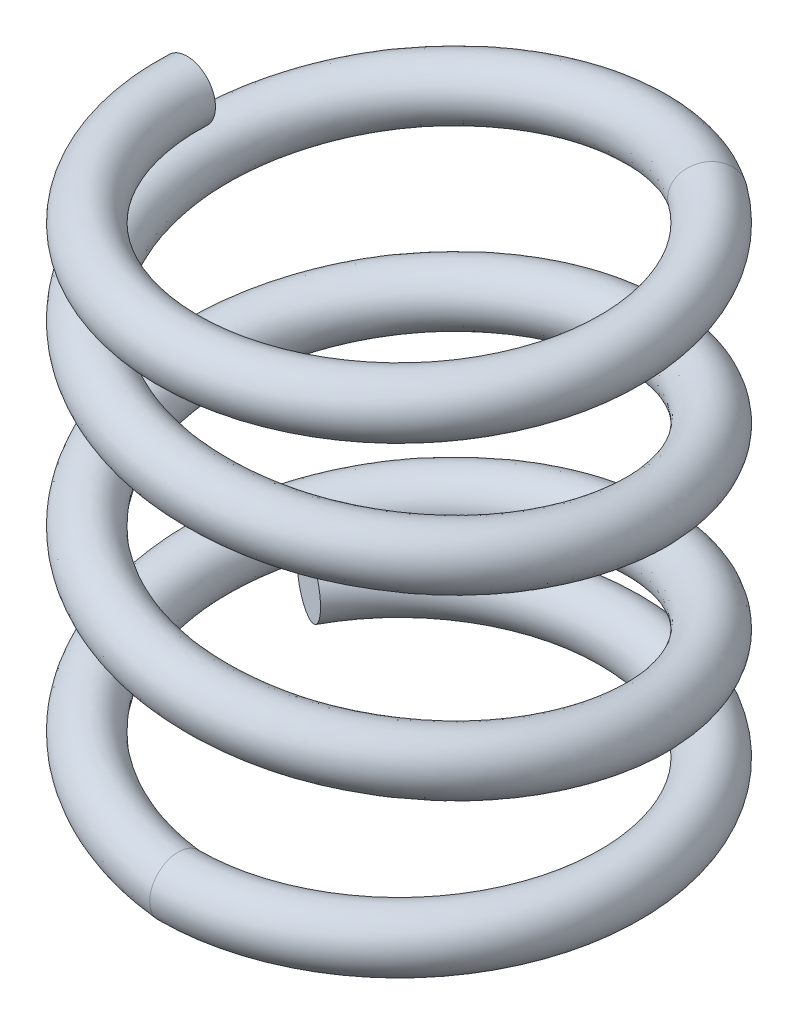
ISO-10303-21;
HEADER;
FILE_DESCRIPTION(('STEP AP214'),'2;1');
FILE_NAME('part.step','',(''),(''),'','','');
FILE_SCHEMA(('AUTOMOTIVE_DESIGN { 1 0 10303 214 1 1 1 1 }'));
ENDSEC;
DATA;
#1=APPLICATION_CONTEXT('core data for automotive mechanical design processes');
#2=APPLICATION_PROTOCOL_DEFINITION('international standard','automotive_design',2000,#1);
#3=PRODUCT_CONTEXT('',#1,'mechanical');
#4=PRODUCT('Part','Part','',(#3));
#5=PRODUCT_RELATED_PRODUCT_CATEGORY('part','',(#4));
#6=PRODUCT_DEFINITION_FORMATION('','',#4);
#7=PRODUCT_DEFINITION_CONTEXT('part definition',#1,'design');
#8=PRODUCT_DEFINITION('design','',#6,#7);
#9=PRODUCT_DEFINITION_SHAPE('','',#8);
#10=(LENGTH_UNIT() NAMED_UNIT(*) SI_UNIT(.MILLI.,.METRE.));
#11=(NAMED_UNIT(*) PLANE_ANGLE_UNIT() SI_UNIT($,.RADIAN.));
#12=(NAMED_UNIT(*) SI_UNIT($,.STERADIAN.) SOLID_ANGLE_UNIT());
#13=UNCERTAINTY_MEASURE_WITH_UNIT(LENGTH_MEASURE(1.E-05),#10,'distance_accuracy_value','');
#14=(GEOMETRIC_REPRESENTATION_CONTEXT(3) GLOBAL_UNCERTAINTY_ASSIGNED_CONTEXT((#13)) GLOBAL_UNIT_ASSIGNED_CONTEXT((#10,
#11,#12)) REPRESENTATION_CONTEXT('',''));
#15=CARTESIAN_POINT('',(0.,0.,0.));
#16=DIRECTION('',(0.,0.,1.));
#17=DIRECTION('',(1.,0.,0.));
#18=AXIS2_PLACEMENT_3D('',#15,#16,#17);
#19=CARTESIAN_POINT('',(0.,0.,2.7));
#20=CARTESIAN_POINT('',(-0.877283179828847,0.125,2.7));
#21=CARTESIAN_POINT('',(-1.58702018118968,0.25,2.18434588481236));
#22=CARTESIAN_POINT('',(-2.29675718255051,0.375,1.66869176962472));
#23=CARTESIAN_POINT('',(-2.56785259399691,0.5,0.834345884812358));
#24=CARTESIAN_POINT('',(-2.83894800544332,0.625,0.));
#25=CARTESIAN_POINT('',(-2.56785259399691,0.75,-0.834345884812358));
#26=CARTESIAN_POINT('',(-2.29675718255051,0.875,-1.66869176962472));
#27=CARTESIAN_POINT('',(-1.58702018118968,1.,-2.18434588481236));
#28=CARTESIAN_POINT('',(-0.877283179828847,1.125,-2.7));
#29=CARTESIAN_POINT('',(0.,1.25,-2.7));
#30=CARTESIAN_POINT('',(0.877283179828847,1.375,-2.7));
#31=CARTESIAN_POINT('',(1.58702018118968,1.5,-2.18434588481236));
#32=CARTESIAN_POINT('',(2.29675718255051,1.625,-1.66869176962472));
#33=CARTESIAN_POINT('',(2.56785259399691,1.75,-0.834345884812358));
#34=CARTESIAN_POINT('',(2.83894800544332,1.875,0.));
#35=CARTESIAN_POINT('',(2.56785259399691,2.,0.834345884812357));
#36=CARTESIAN_POINT('',(2.29675718255051,2.125,1.66869176962472));
#37=CARTESIAN_POINT('',(1.58702018118968,2.25,2.18434588481236));
#38=CARTESIAN_POINT('',(0.877283179828848,2.375,2.7));
#39=CARTESIAN_POINT('',(0.,2.5,2.7));
#40=CARTESIAN_POINT('',(-0.877283179828847,2.625,2.7));
#41=CARTESIAN_POINT('',(-1.58702018118968,2.75,2.18434588481236));
#42=CARTESIAN_POINT('',(-2.29675718255051,2.875,1.66869176962472));
#43=CARTESIAN_POINT('',(-2.56785259399691,3.,0.834345884812358));
#44=CARTESIAN_POINT('',(-2.83894800544332,3.125,0.));
#45=CARTESIAN_POINT('',(-2.56785259399691,3.25,-0.834345884812358));
#46=CARTESIAN_POINT('',(-2.29675718255051,3.375,-1.66869176962472));
#47=CARTESIAN_POINT('',(-1.58702018118968,3.5,-2.18434588481236));
#48=CARTESIAN_POINT('',(-0.877283179828847,3.625,-2.7));
#49=CARTESIAN_POINT('',(0.,3.75,-2.7));
#50=CARTESIAN_POINT('',(0.877283179828847,3.875,-2.7));
#51=CARTESIAN_POINT('',(1.58702018118968,4.,-2.18434588481236));
#52=CARTESIAN_POINT('',(2.29675718255051,4.125,-1.66869176962472));
#53=CARTESIAN_POINT('',(2.56785259399691,4.25,-0.834345884812358));
#54=CARTESIAN_POINT('',(2.83894800544332,4.375,0.));
#55=CARTESIAN_POINT('',(2.56785259399691,4.5,0.834345884812357));
#56=CARTESIAN_POINT('',(2.29675718255051,4.625,1.66869176962472));
#57=CARTESIAN_POINT('',(1.58702018118968,4.75,2.18434588481236));
#58=CARTESIAN_POINT('',(0.877283179828848,4.875,2.7));
#59=CARTESIAN_POINT('',(0.,5.,2.7));
#60=CARTESIAN_POINT('',(-0.877283179828847,5.125,2.7));
#61=CARTESIAN_POINT('',(-1.58702018118968,5.25,2.18434588481236));
#62=CARTESIAN_POINT('',(-2.29675718255051,5.375,1.66869176962472));
#63=CARTESIAN_POINT('',(-2.56785259399691,5.5,0.834345884812358));
#64=CARTESIAN_POINT('',(-2.83894800544332,5.625,0.));
#65=CARTESIAN_POINT('',(-2.56785259399691,5.75,-0.834345884812358));
#66=CARTESIAN_POINT('',(-2.29675718255051,5.875,-1.66869176962472));
#67=CARTESIAN_POINT('',(-1.58702018118968,6.,-2.18434588481236));
#68=CARTESIAN_POINT('',(-0.877283179828847,6.125,-2.7));
#69=CARTESIAN_POINT('',(0.,6.25,-2.7));
#70=CARTESIAN_POINT('',(0.877283179828847,6.375,-2.7));
#71=CARTESIAN_POINT('',(1.58702018118968,6.5,-2.18434588481236));
#72=CARTESIAN_POINT('',(0.,0.800000000000001,2.7));
#73=CARTESIAN_POINT('',(-0.877283179828847,0.925000000000001,2.7));
#74=CARTESIAN_POINT('',(-1.58702018118968,1.05,2.18434588481236));
#75=CARTESIAN_POINT('',(-2.29675718255051,1.175,1.66869176962472));
#76=CARTESIAN_POINT('',(-2.56785259399691,1.3,0.834345884812358));
#77=CARTESIAN_POINT('',(-2.83894800544332,1.425,0.));
#78=CARTESIAN_POINT('',(-2.56785259399691,1.55,-0.834345884812358));
#79=CARTESIAN_POINT('',(-2.29675718255051,1.675,-1.66869176962472));
#80=CARTESIAN_POINT('',(-1.58702018118968,1.8,-2.18434588481236));
#81=CARTESIAN_POINT('',(-0.877283179828847,1.925,-2.7));
#82=CARTESIAN_POINT('',(0.,2.05,-2.7));
#83=CARTESIAN_POINT('',(0.877283179828847,2.175,-2.7));
#84=CARTESIAN_POINT('',(1.58702018118968,2.3,-2.18434588481236));
#85=CARTESIAN_POINT('',(2.29675718255051,2.425,-1.66869176962472));
#86=CARTESIAN_POINT('',(2.56785259399691,2.55,-0.834345884812358));
#87=CARTESIAN_POINT('',(2.83894800544332,2.675,0.));
#88=CARTESIAN_POINT('',(2.56785259399691,2.8,0.834345884812357));
#89=CARTESIAN_POINT('',(2.29675718255051,2.925,1.66869176962472));
#90=CARTESIAN_POINT('',(1.58702018118968,3.05,2.18434588481236));
#91=CARTESIAN_POINT('',(0.877283179828848,3.175,2.7));
#92=CARTESIAN_POINT('',(0.,3.3,2.7));
#93=CARTESIAN_POINT('',(-0.877283179828847,3.425,2.7));
#94=CARTESIAN_POINT('',(-1.58702018118968,3.55,2.18434588481236));
#95=CARTESIAN_POINT('',(-2.29675718255051,3.675,1.66869176962472));
#96=CARTESIAN_POINT('',(-2.56785259399691,3.8,0.834345884812358));
#97=CARTESIAN_POINT('',(-2.83894800544332,3.925,0.));
#98=CARTESIAN_POINT('',(-2.56785259399691,4.05,-0.834345884812358));
#99=CARTESIAN_POINT('',(-2.29675718255051,4.175,-1.66869176962472));
#100=CARTESIAN_POINT('',(-1.58702018118968,4.3,-2.18434588481236));
#101=CARTESIAN_POINT('',(-0.877283179828847,4.425,-2.7));
#102=CARTESIAN_POINT('',(0.,4.55,-2.7));
#103=CARTESIAN_POINT('',(0.877283179828847,4.675,-2.7));
#104=CARTESIAN_POINT('',(1.58702018118968,4.8,-2.18434588481236));
#105=CARTESIAN_POINT('',(2.29675718255051,4.925,-1.66869176962472));
#106=CARTESIAN_POINT('',(2.56785259399691,5.05,-0.834345884812358));
#107=CARTESIAN_POINT('',(2.83894800544332,5.175,0.));
#108=CARTESIAN_POINT('',(2.56785259399691,5.3,0.834345884812357));
#109=CARTESIAN_POINT('',(2.29675718255051,5.425,1.66869176962472));
#110=CARTESIAN_POINT('',(1.58702018118968,5.55,2.18434588481236));
#111=CARTESIAN_POINT('',(0.877283179828848,5.675,2.7));
#112=CARTESIAN_POINT('',(0.,5.8,2.7));
#113=CARTESIAN_POINT('',(-0.877283179828847,5.925,2.7));
#114=CARTESIAN_POINT('',(-1.58702018118968,6.05,2.18434588481236));
#115=CARTESIAN_POINT('',(-2.29675718255051,6.175,1.66869176962472));
#116=CARTESIAN_POINT('',(-2.56785259399691,6.3,0.834345884812358));
#117=CARTESIAN_POINT('',(-2.83894800544332,6.425,0.));
#118=CARTESIAN_POINT('',(-2.56785259399691,6.55,-0.834345884812358));
#119=CARTESIAN_POINT('',(-2.29675718255051,6.675,-1.66869176962472));
#120=CARTESIAN_POINT('',(-1.58702018118968,6.8,-2.18434588481236));
#121=CARTESIAN_POINT('',(-0.877283179828847,6.925,-2.7));
#122=CARTESIAN_POINT('',(0.,7.05,-2.7));
#123=CARTESIAN_POINT('',(0.877283179828847,7.175,-2.7));
#124=CARTESIAN_POINT('',(1.58702018118968,7.3,-2.18434588481236));
#125=CARTESIAN_POINT('',(0.,0.800000000000001,3.5));
#126=CARTESIAN_POINT('',(-1.13721893681517,0.925000000000001,3.5));
#127=CARTESIAN_POINT('',(-2.05724838302366,1.05,2.83155948031232));
#128=CARTESIAN_POINT('',(-2.97727782923214,1.175,2.16311896062463));
#129=CARTESIAN_POINT('',(-3.32869780703304,1.3,1.08155948031232));
#130=CARTESIAN_POINT('',(-3.68011778483394,1.425,0.));
#131=CARTESIAN_POINT('',(-3.32869780703304,1.55,-1.08155948031232));
#132=CARTESIAN_POINT('',(-2.97727782923214,1.675,-2.16311896062463));
#133=CARTESIAN_POINT('',(-2.05724838302366,1.8,-2.83155948031232));
#134=CARTESIAN_POINT('',(-1.13721893681517,1.925,-3.5));
#135=CARTESIAN_POINT('',(0.,2.05,-3.5));
#136=CARTESIAN_POINT('',(1.13721893681517,2.175,-3.5));
#137=CARTESIAN_POINT('',(2.05724838302366,2.3,-2.83155948031232));
#138=CARTESIAN_POINT('',(2.97727782923214,2.425,-2.16311896062463));
#139=CARTESIAN_POINT('',(3.32869780703304,2.55,-1.08155948031232));
#140=CARTESIAN_POINT('',(3.68011778483394,2.675,0.));
#141=CARTESIAN_POINT('',(3.32869780703304,2.8,1.08155948031232));
#142=CARTESIAN_POINT('',(2.97727782923214,2.925,2.16311896062463));
#143=CARTESIAN_POINT('',(2.05724838302366,3.05,2.83155948031232));
#144=CARTESIAN_POINT('',(1.13721893681517,3.175,3.5));
#145=CARTESIAN_POINT('',(0.,3.3,3.5));
#146=CARTESIAN_POINT('',(-1.13721893681517,3.425,3.5));
#147=CARTESIAN_POINT('',(-2.05724838302366,3.55,2.83155948031232));
#148=CARTESIAN_POINT('',(-2.97727782923214,3.675,2.16311896062463));
#149=CARTESIAN_POINT('',(-3.32869780703304,3.8,1.08155948031232));
#150=CARTESIAN_POINT('',(-3.68011778483394,3.925,0.));
#151=CARTESIAN_POINT('',(-3.32869780703304,4.05,-1.08155948031232));
#152=CARTESIAN_POINT('',(-2.97727782923214,4.175,-2.16311896062463));
#153=CARTESIAN_POINT('',(-2.05724838302366,4.3,-2.83155948031232));
#154=CARTESIAN_POINT('',(-1.13721893681517,4.425,-3.5));
#155=CARTESIAN_POINT('',(0.,4.55,-3.5));
#156=CARTESIAN_POINT('',(1.13721893681517,4.675,-3.5));
#157=CARTESIAN_POINT('',(2.05724838302366,4.8,-2.83155948031232));
#158=CARTESIAN_POINT('',(2.97727782923214,4.925,-2.16311896062463));
#159=CARTESIAN_POINT('',(3.32869780703304,5.05,-1.08155948031232));
#160=CARTESIAN_POINT('',(3.68011778483394,5.175,0.));
#161=CARTESIAN_POINT('',(3.32869780703304,5.3,1.08155948031232));
#162=CARTESIAN_POINT('',(2.97727782923214,5.425,2.16311896062463));
#163=CARTESIAN_POINT('',(2.05724838302366,5.55,2.83155948031232));
#164=CARTESIAN_POINT('',(1.13721893681517,5.675,3.5));
#165=CARTESIAN_POINT('',(0.,5.8,3.5));
#166=CARTESIAN_POINT('',(-1.13721893681517,5.925,3.5));
#167=CARTESIAN_POINT('',(-2.05724838302366,6.05,2.83155948031232));
#168=CARTESIAN_POINT('',(-2.97727782923214,6.175,2.16311896062463));
#169=CARTESIAN_POINT('',(-3.32869780703304,6.3,1.08155948031232));
#170=CARTESIAN_POINT('',(-3.68011778483394,6.425,0.));
#171=CARTESIAN_POINT('',(-3.32869780703304,6.55,-1.08155948031232));
#172=CARTESIAN_POINT('',(-2.97727782923214,6.675,-2.16311896062463));
#173=CARTESIAN_POINT('',(-2.05724838302366,6.8,-2.83155948031232));
#174=CARTESIAN_POINT('',(-1.13721893681517,6.925,-3.5));
#175=CARTESIAN_POINT('',(0.,7.05,-3.5));
#176=CARTESIAN_POINT('',(1.13721893681517,7.175,-3.5));
#177=CARTESIAN_POINT('',(2.05724838302366,7.3,-2.83155948031232));
#178=CARTESIAN_POINT('',(0.,0.,3.5));
#179=CARTESIAN_POINT('',(-1.13721893681517,0.125,3.5));
#180=CARTESIAN_POINT('',(-2.05724838302366,0.25,2.83155948031232));
#181=CARTESIAN_POINT('',(-2.97727782923214,0.375,2.16311896062463));
#182=CARTESIAN_POINT('',(-3.32869780703304,0.5,1.08155948031232));
#183=CARTESIAN_POINT('',(-3.68011778483394,0.625,0.));
#184=CARTESIAN_POINT('',(-3.32869780703304,0.75,-1.08155948031232));
#185=CARTESIAN_POINT('',(-2.97727782923214,0.875,-2.16311896062463));
#186=CARTESIAN_POINT('',(-2.05724838302366,1.,-2.83155948031232));
#187=CARTESIAN_POINT('',(-1.13721893681517,1.125,-3.5));
#188=CARTESIAN_POINT('',(0.,1.25,-3.5));
#189=CARTESIAN_POINT('',(1.13721893681517,1.375,-3.5));
#190=CARTESIAN_POINT('',(2.05724838302366,1.5,-2.83155948031232));
#191=CARTESIAN_POINT('',(2.97727782923214,1.625,-2.16311896062463));
#192=CARTESIAN_POINT('',(3.32869780703304,1.75,-1.08155948031232));
#193=CARTESIAN_POINT('',(3.68011778483394,1.875,0.));
#194=CARTESIAN_POINT('',(3.32869780703304,2.,1.08155948031232));
#195=CARTESIAN_POINT('',(2.97727782923214,2.125,2.16311896062463));
#196=CARTESIAN_POINT('',(2.05724838302366,2.25,2.83155948031232));
#197=CARTESIAN_POINT('',(1.13721893681517,2.375,3.5));
#198=CARTESIAN_POINT('',(0.,2.5,3.5));
#199=CARTESIAN_POINT('',(-1.13721893681517,2.625,3.5));
#200=CARTESIAN_POINT('',(-2.05724838302366,2.75,2.83155948031232));
#201=CARTESIAN_POINT('',(-2.97727782923214,2.875,2.16311896062463));
#202=CARTESIAN_POINT('',(-3.32869780703304,3.,1.08155948031232));
#203=CARTESIAN_POINT('',(-3.68011778483394,3.125,0.));
#204=CARTESIAN_POINT('',(-3.32869780703304,3.25,-1.08155948031232));
#205=CARTESIAN_POINT('',(-2.97727782923214,3.375,-2.16311896062463));
#206=CARTESIAN_POINT('',(-2.05724838302366,3.5,-2.83155948031232));
#207=CARTESIAN_POINT('',(-1.13721893681517,3.625,-3.5));
#208=CARTESIAN_POINT('',(0.,3.75,-3.5));
#209=CARTESIAN_POINT('',(1.13721893681517,3.875,-3.5));
#210=CARTESIAN_POINT('',(2.05724838302366,4.,-2.83155948031232));
#211=CARTESIAN_POINT('',(2.97727782923214,4.125,-2.16311896062463));
#212=CARTESIAN_POINT('',(3.32869780703304,4.25,-1.08155948031232));
#213=CARTESIAN_POINT('',(3.68011778483394,4.375,0.));
#214=CARTESIAN_POINT('',(3.32869780703304,4.5,1.08155948031232));
#215=CARTESIAN_POINT('',(2.97727782923214,4.625,2.16311896062463));
#216=CARTESIAN_POINT('',(2.05724838302366,4.75,2.83155948031232));
#217=CARTESIAN_POINT('',(1.13721893681517,4.875,3.5));
#218=CARTESIAN_POINT('',(0.,5.,3.5));
#219=CARTESIAN_POINT('',(-1.13721893681517,5.125,3.5));
#220=CARTESIAN_POINT('',(-2.05724838302366,5.25,2.83155948031232));
#221=CARTESIAN_POINT('',(-2.97727782923214,5.375,2.16311896062463));
#222=CARTESIAN_POINT('',(-3.32869780703304,5.5,1.08155948031232));
#223=CARTESIAN_POINT('',(-3.68011778483394,5.625,0.));
#224=CARTESIAN_POINT('',(-3.32869780703304,5.75,-1.08155948031232));
#225=CARTESIAN_POINT('',(-2.97727782923214,5.875,-2.16311896062463));
#226=CARTESIAN_POINT('',(-2.05724838302366,6.,-2.83155948031232));
#227=CARTESIAN_POINT('',(-1.13721893681517,6.125,-3.5));
#228=CARTESIAN_POINT('',(0.,6.25,-3.5));
#229=CARTESIAN_POINT('',(1.13721893681517,6.375,-3.5));
#230=CARTESIAN_POINT('',(2.05724838302366,6.5,-2.83155948031232));
#231=CARTESIAN_POINT('',(0.,-0.800000000000001,3.5));
#232=CARTESIAN_POINT('',(-1.13721893681517,-0.675000000000001,3.5));
#233=CARTESIAN_POINT('',(-2.05724838302366,-0.550000000000001,2.83155948031232));
#234=CARTESIAN_POINT('',(-2.97727782923214,-0.425000000000001,2.16311896062463));
#235=CARTESIAN_POINT('',(-3.32869780703304,-0.300000000000001,1.08155948031232));
#236=CARTESIAN_POINT('',(-3.68011778483394,-0.175000000000001,0.));
#237=CARTESIAN_POINT('',(-3.32869780703304,-0.0500000000000008,-1.08155948031232));
#238=CARTESIAN_POINT('',(-2.97727782923214,0.0749999999999992,-2.16311896062463));
#239=CARTESIAN_POINT('',(-2.05724838302366,0.199999999999999,-2.83155948031232));
#240=CARTESIAN_POINT('',(-1.13721893681517,0.324999999999999,-3.5));
#241=CARTESIAN_POINT('',(0.,0.449999999999999,-3.5));
#242=CARTESIAN_POINT('',(1.13721893681517,0.574999999999999,-3.5));
#243=CARTESIAN_POINT('',(2.05724838302366,0.699999999999999,-2.83155948031232));
#244=CARTESIAN_POINT('',(2.97727782923214,0.824999999999999,-2.16311896062463));
#245=CARTESIAN_POINT('',(3.32869780703304,0.949999999999999,-1.08155948031232));
#246=CARTESIAN_POINT('',(3.68011778483394,1.075,0.));
#247=CARTESIAN_POINT('',(3.32869780703304,1.2,1.08155948031232));
#248=CARTESIAN_POINT('',(2.97727782923214,1.325,2.16311896062463));
#249=CARTESIAN_POINT('',(2.05724838302366,1.45,2.83155948031232));
#250=CARTESIAN_POINT('',(1.13721893681517,1.575,3.5));
#251=CARTESIAN_POINT('',(0.,1.7,3.5));
#252=CARTESIAN_POINT('',(-1.13721893681517,1.825,3.5));
#253=CARTESIAN_POINT('',(-2.05724838302366,1.95,2.83155948031232));
#254=CARTESIAN_POINT('',(-2.97727782923214,2.075,2.16311896062463));
#255=CARTESIAN_POINT('',(-3.32869780703304,2.2,1.08155948031232));
#256=CARTESIAN_POINT('',(-3.68011778483394,2.325,0.));
#257=CARTESIAN_POINT('',(-3.32869780703304,2.45,-1.08155948031232));
#258=CARTESIAN_POINT('',(-2.97727782923214,2.575,-2.16311896062463));
#259=CARTESIAN_POINT('',(-2.05724838302366,2.7,-2.83155948031232));
#260=CARTESIAN_POINT('',(-1.13721893681517,2.825,-3.5));
#261=CARTESIAN_POINT('',(0.,2.95,-3.5));
#262=CARTESIAN_POINT('',(1.13721893681517,3.075,-3.5));
#263=CARTESIAN_POINT('',(2.05724838302366,3.2,-2.83155948031232));
#264=CARTESIAN_POINT('',(2.97727782923214,3.325,-2.16311896062463));
#265=CARTESIAN_POINT('',(3.32869780703304,3.45,-1.08155948031232));
#266=CARTESIAN_POINT('',(3.68011778483394,3.575,0.));
#267=CARTESIAN_POINT('',(3.32869780703304,3.7,1.08155948031232));
#268=CARTESIAN_POINT('',(2.97727782923214,3.825,2.16311896062463));
#269=CARTESIAN_POINT('',(2.05724838302366,3.95,2.83155948031232));
#270=CARTESIAN_POINT('',(1.13721893681517,4.075,3.5));
#271=CARTESIAN_POINT('',(0.,4.2,3.5));
#272=CARTESIAN_POINT('',(-1.13721893681517,4.325,3.5));
#273=CARTESIAN_POINT('',(-2.05724838302366,4.45,2.83155948031232));
#274=CARTESIAN_POINT('',(-2.97727782923214,4.575,2.16311896062463));
#275=CARTESIAN_POINT('',(-3.32869780703304,4.7,1.08155948031232));
#276=CARTESIAN_POINT('',(-3.68011778483394,4.825,0.));
#277=CARTESIAN_POINT('',(-3.32869780703304,4.95,-1.08155948031232));
#278=CARTESIAN_POINT('',(-2.97727782923214,5.075,-2.16311896062463));
#279=CARTESIAN_POINT('',(-2.05724838302366,5.2,-2.83155948031232));
#280=CARTESIAN_POINT('',(-1.13721893681517,5.325,-3.5));
#281=CARTESIAN_POINT('',(0.,5.45,-3.5));
#282=CARTESIAN_POINT('',(1.13721893681517,5.575,-3.5));
#283=CARTESIAN_POINT('',(2.05724838302366,5.7,-2.83155948031232));
#284=CARTESIAN_POINT('',(0.,-0.800000000000001,2.7));
#285=CARTESIAN_POINT('',(-0.877283179828847,-0.675000000000001,2.7));
#286=CARTESIAN_POINT('',(-1.58702018118968,-0.550000000000001,2.18434588481236));
#287=CARTESIAN_POINT('',(-2.29675718255051,-0.425000000000001,1.66869176962472));
#288=CARTESIAN_POINT('',(-2.56785259399691,-0.300000000000001,0.834345884812358));
#289=CARTESIAN_POINT('',(-2.83894800544332,-0.175000000000001,0.));
#290=CARTESIAN_POINT('',(-2.56785259399691,-0.0500000000000008,-0.834345884812358));
#291=CARTESIAN_POINT('',(-2.29675718255051,0.0749999999999992,-1.66869176962472));
#292=CARTESIAN_POINT('',(-1.58702018118968,0.199999999999999,-2.18434588481236));
#293=CARTESIAN_POINT('',(-0.877283179828847,0.324999999999999,-2.7));
#294=CARTESIAN_POINT('',(0.,0.449999999999999,-2.7));
#295=CARTESIAN_POINT('',(0.877283179828847,0.574999999999999,-2.7));
#296=CARTESIAN_POINT('',(1.58702018118968,0.699999999999999,-2.18434588481236));
#297=CARTESIAN_POINT('',(2.29675718255051,0.824999999999999,-1.66869176962472));
#298=CARTESIAN_POINT('',(2.56785259399691,0.949999999999999,-0.834345884812358));
#299=CARTESIAN_POINT('',(2.83894800544332,1.075,0.));
#300=CARTESIAN_POINT('',(2.56785259399691,1.2,0.834345884812357));
#301=CARTESIAN_POINT('',(2.29675718255051,1.325,1.66869176962472));
#302=CARTESIAN_POINT('',(1.58702018118968,1.45,2.18434588481236));
#303=CARTESIAN_POINT('',(0.877283179828848,1.575,2.7));
#304=CARTESIAN_POINT('',(0.,1.7,2.7));
#305=CARTESIAN_POINT('',(-0.877283179828847,1.825,2.7));
#306=CARTESIAN_POINT('',(-1.58702018118968,1.95,2.18434588481236));
#307=CARTESIAN_POINT('',(-2.29675718255051,2.075,1.66869176962472));
#308=CARTESIAN_POINT('',(-2.56785259399691,2.2,0.834345884812358));
#309=CARTESIAN_POINT('',(-2.83894800544332,2.325,0.));
#310=CARTESIAN_POINT('',(-2.56785259399691,2.45,-0.834345884812358));
#311=CARTESIAN_POINT('',(-2.29675718255051,2.575,-1.66869176962472));
#312=CARTESIAN_POINT('',(-1.58702018118968,2.7,-2.18434588481236));
#313=CARTESIAN_POINT('',(-0.877283179828847,2.825,-2.7));
#314=CARTESIAN_POINT('',(0.,2.95,-2.7));
#315=CARTESIAN_POINT('',(0.877283179828847,3.075,-2.7));
#316=CARTESIAN_POINT('',(1.58702018118968,3.2,-2.18434588481236));
#317=CARTESIAN_POINT('',(2.29675718255051,3.325,-1.66869176962472));
#318=CARTESIAN_POINT('',(2.56785259399691,3.45,-0.834345884812358));
#319=CARTESIAN_POINT('',(2.83894800544332,3.575,0.));
#320=CARTESIAN_POINT('',(2.56785259399691,3.7,0.834345884812357));
#321=CARTESIAN_POINT('',(2.29675718255051,3.825,1.66869176962472));
#322=CARTESIAN_POINT('',(1.58702018118968,3.95,2.18434588481236));
#323=CARTESIAN_POINT('',(0.877283179828848,4.075,2.7));
#324=CARTESIAN_POINT('',(0.,4.2,2.7));
#325=CARTESIAN_POINT('',(-0.877283179828847,4.325,2.7));
#326=CARTESIAN_POINT('',(-1.58702018118968,4.45,2.18434588481236));
#327=CARTESIAN_POINT('',(-2.29675718255051,4.575,1.66869176962472));
#328=CARTESIAN_POINT('',(-2.56785259399691,4.7,0.834345884812358));
#329=CARTESIAN_POINT('',(-2.83894800544332,4.825,0.));
#330=CARTESIAN_POINT('',(-2.56785259399691,4.95,-0.834345884812358));
#331=CARTESIAN_POINT('',(-2.29675718255051,5.075,-1.66869176962472));
#332=CARTESIAN_POINT('',(-1.58702018118968,5.2,-2.18434588481236));
#333=CARTESIAN_POINT('',(-0.877283179828847,5.325,-2.7));
#334=CARTESIAN_POINT('',(0.,5.45,-2.7));
#335=CARTESIAN_POINT('',(0.877283179828847,5.575,-2.7));
#336=CARTESIAN_POINT('',(1.58702018118968,5.7,-2.18434588481236));
#337=CARTESIAN_POINT('',(0.,0.,2.7));
#338=CARTESIAN_POINT('',(-0.877283179828847,0.125,2.7));
#339=CARTESIAN_POINT('',(-1.58702018118968,0.25,2.18434588481236));
#340=CARTESIAN_POINT('',(-2.29675718255051,0.375,1.66869176962472));
#341=CARTESIAN_POINT('',(-2.56785259399691,0.5,0.834345884812358));
#342=CARTESIAN_POINT('',(-2.83894800544332,0.625,0.));
#343=CARTESIAN_POINT('',(-2.56785259399691,0.75,-0.834345884812358));
#344=CARTESIAN_POINT('',(-2.29675718255051,0.875,-1.66869176962472));
#345=CARTESIAN_POINT('',(-1.58702018118968,1.,-2.18434588481236));
#346=CARTESIAN_POINT('',(-0.877283179828847,1.125,-2.7));
#347=CARTESIAN_POINT('',(0.,1.25,-2.7));
#348=CARTESIAN_POINT('',(0.877283179828847,1.375,-2.7));
#349=CARTESIAN_POINT('',(1.58702018118968,1.5,-2.18434588481236));
#350=CARTESIAN_POINT('',(2.29675718255051,1.625,-1.66869176962472));
#351=CARTESIAN_POINT('',(2.56785259399691,1.75,-0.834345884812358));
#352=CARTESIAN_POINT('',(2.83894800544332,1.875,0.));
#353=CARTESIAN_POINT('',(2.56785259399691,2.,0.834345884812357));
#354=CARTESIAN_POINT('',(2.29675718255051,2.125,1.66869176962472));
#355=CARTESIAN_POINT('',(1.58702018118968,2.25,2.18434588481236));
#356=CARTESIAN_POINT('',(0.877283179828848,2.375,2.7));
#357=CARTESIAN_POINT('',(0.,2.5,2.7));
#358=CARTESIAN_POINT('',(-0.877283179828847,2.625,2.7));
#359=CARTESIAN_POINT('',(-1.58702018118968,2.75,2.18434588481236));
#360=CARTESIAN_POINT('',(-2.29675718255051,2.875,1.66869176962472));
#361=CARTESIAN_POINT('',(-2.56785259399691,3.,0.834345884812358));
#362=CARTESIAN_POINT('',(-2.83894800544332,3.125,0.));
#363=CARTESIAN_POINT('',(-2.56785259399691,3.25,-0.834345884812358));
#364=CARTESIAN_POINT('',(-2.29675718255051,3.375,-1.66869176962472));
#365=CARTESIAN_POINT('',(-1.58702018118968,3.5,-2.18434588481236));
#366=CARTESIAN_POINT('',(-0.877283179828847,3.625,-2.7));
#367=CARTESIAN_POINT('',(0.,3.75,-2.7));
#368=CARTESIAN_POINT('',(0.877283179828847,3.875,-2.7));
#369=CARTESIAN_POINT('',(1.58702018118968,4.,-2.18434588481236));
#370=CARTESIAN_POINT('',(2.29675718255051,4.125,-1.66869176962472));
#371=CARTESIAN_POINT('',(2.56785259399691,4.25,-0.834345884812358));
#372=CARTESIAN_POINT('',(2.83894800544332,4.375,0.));
#373=CARTESIAN_POINT('',(2.56785259399691,4.5,0.834345884812357));
#374=CARTESIAN_POINT('',(2.29675718255051,4.625,1.66869176962472));
#375=CARTESIAN_POINT('',(1.58702018118968,4.75,2.18434588481236));
#376=CARTESIAN_POINT('',(0.877283179828848,4.875,2.7));
#377=CARTESIAN_POINT('',(0.,5.,2.7));
#378=CARTESIAN_POINT('',(-0.877283179828847,5.125,2.7));
#379=CARTESIAN_POINT('',(-1.58702018118968,5.25,2.18434588481236));
#380=CARTESIAN_POINT('',(-2.29675718255051,5.375,1.66869176962472));
#381=CARTESIAN_POINT('',(-2.56785259399691,5.5,0.834345884812358));
#382=CARTESIAN_POINT('',(-2.83894800544332,5.625,0.));
#383=CARTESIAN_POINT('',(-2.56785259399691,5.75,-0.834345884812358));
#384=CARTESIAN_POINT('',(-2.29675718255051,5.875,-1.66869176962472));
#385=CARTESIAN_POINT('',(-1.58702018118968,6.,-2.18434588481236));
#386=CARTESIAN_POINT('',(-0.877283179828847,6.125,-2.7));
#387=CARTESIAN_POINT('',(0.,6.25,-2.7));
#388=CARTESIAN_POINT('',(0.877283179828847,6.375,-2.7));
#389=CARTESIAN_POINT('',(1.58702018118968,6.5,-2.18434588481236));
#390=(BOUNDED_SURFACE() B_SPLINE_SURFACE(3,2,((#19,#20,#21,#22,#23,#24,#25,#26,#27,#28,#29,#30,
#31,#32,#33,#34,#35,#36,#37,#38,#39,#40,#41,#42,#43,#44,#45,#46,#47,#48,#49,#50,#51,#52,#53,#54,
#55,#56,#57,#58,#59,#60,#61,#62,#63,#64,#65,#66,#67,#68,#69,#70,#71),(#72,#73,#74,#75,#76,#77,
#78,#79,#80,#81,#82,#83,#84,#85,#86,#87,#88,#89,#90,#91,#92,#93,#94,#95,#96,#97,#98,#99,#100,
#101,#102,#103,#104,#105,#106,#107,#108,#109,#110,#111,#112,#113,#114,#115,#116,#117,#118,#119,
#120,#121,#122,#123,#124),(#125,#126,#127,#128,#129,#130,#131,#132,#133,#134,#135,#136,#137,
#138,#139,#140,#141,#142,#143,#144,#145,#146,#147,#148,#149,#150,#151,#152,#153,#154,#155,#156,
#157,#158,#159,#160,#161,#162,#163,#164,#165,#166,#167,#168,#169,#170,#171,#172,#173,#174,#175,
#176,#177),(#178,#179,#180,#181,#182,#183,#184,#185,#186,#187,#188,#189,#190,#191,#192,#193,
#194,#195,#196,#197,#198,#199,#200,#201,#202,#203,#204,#205,#206,#207,#208,#209,#210,#211,#212,
#213,#214,#215,#216,#217,#218,#219,#220,#221,#222,#223,#224,#225,#226,#227,#228,#229,#230),
(#231,#232,#233,#234,#235,#236,#237,#238,#239,#240,#241,#242,#243,#244,#245,#246,#247,#248,#249,
#250,#251,#252,#253,#254,#255,#256,#257,#258,#259,#260,#261,#262,#263,#264,#265,#266,#267,#268,
#269,#270,#271,#272,#273,#274,#275,#276,#277,#278,#279,#280,#281,#282,#283),(#284,#285,#286,
#287,#288,#289,#290,#291,#292,#293,#294,#295,#296,#297,#298,#299,#300,#301,#302,#303,#304,#305,
#306,#307,#308,#309,#310,#311,#312,#313,#314,#315,#316,#317,#318,#319,#320,#321,#322,#323,#324,
#325,#326,#327,#328,#329,#330,#331,#332,#333,#334,#335,#336),(#337,#338,#339,#340,#341,#342,
#343,#344,#345,#346,#347,#348,#349,#350,#351,#352,#353,#354,#355,#356,#357,#358,#359,#360,#361,
#362,#363,#364,#365,#366,#367,#368,#369,#370,#371,#372,#373,#374,#375,#376,#377,#378,#379,#380,
#381,#382,#383,#384,#385,#386,#387,#388,#389)),.UNSPECIFIED.,.T.,.F.,
.F.) B_SPLINE_SURFACE_WITH_KNOTS((4,3,4),(3,2,2,2,2,2,2,2,2,2,2,2,2,2,2,2,2,2,2,2,2,2,2,2,2,2,
3),(0.,0.5,1.),(0.,0.0333333333333333,0.0666666666666667,0.1,0.133333333333333,
0.166666666666667,0.2,0.233333333333333,0.266666666666667,0.3,0.333333333333333,
0.366666666666667,0.4,0.433333333333333,0.466666666666667,0.5,0.533333333333333,
0.566666666666667,0.6,0.633333333333333,0.666666666666667,0.7,0.733333333333333,
0.766666666666667,0.8,0.833333333333333,0.866666666666667),
.UNSPECIFIED.) GEOMETRIC_REPRESENTATION_ITEM() RATIONAL_B_SPLINE_SURFACE(((1.,0.951056516295154,
1.,0.951056516295154,1.,0.951056516295154,1.,0.951056516295154,1.,0.951056516295154,1.,
0.951056516295154,1.,0.951056516295154,1.,0.951056516295154,1.,0.951056516295154,1.,
0.951056516295154,1.,0.951056516295154,1.,0.951056516295154,1.,0.951056516295154,1.,
0.951056516295154,1.,0.951056516295154,1.,0.951056516295154,1.,0.951056516295154,1.,
0.951056516295154,1.,0.951056516295154,1.,0.951056516295154,1.,0.951056516295154,1.,
0.951056516295154,1.,0.951056516295154,1.,0.951056516295154,1.,0.951056516295154,1.,
0.951056516295154,1.),(0.333333333333333,0.317018838765051,0.333333333333333,0.317018838765051,
0.333333333333333,0.317018838765051,0.333333333333333,0.317018838765051,0.333333333333333,
0.317018838765051,0.333333333333333,0.317018838765051,0.333333333333333,0.317018838765051,
0.333333333333333,0.317018838765051,0.333333333333333,0.317018838765051,0.333333333333333,
0.317018838765051,0.333333333333333,0.317018838765051,0.333333333333333,0.317018838765051,
0.333333333333333,0.317018838765051,0.333333333333333,0.317018838765051,0.333333333333333,
0.317018838765051,0.333333333333333,0.317018838765051,0.333333333333333,0.317018838765051,
0.333333333333333,0.317018838765051,0.333333333333333,0.317018838765051,0.333333333333333,
0.317018838765051,0.333333333333333,0.317018838765051,0.333333333333333,0.317018838765051,
0.333333333333333,0.317018838765051,0.333333333333333,0.317018838765051,0.333333333333333,
0.317018838765051,0.333333333333333,0.317018838765051,0.333333333333333),(0.333333333333333,
0.317018838765051,0.333333333333333,0.317018838765051,0.333333333333333,0.317018838765051,
0.333333333333333,0.317018838765051,0.333333333333333,0.317018838765051,0.333333333333333,
0.317018838765051,0.333333333333333,0.317018838765051,0.333333333333333,0.317018838765051,
0.333333333333333,0.317018838765051,0.333333333333333,0.317018838765051,0.333333333333333,
0.317018838765051,0.333333333333333,0.317018838765051,0.333333333333333,0.317018838765051,
0.333333333333333,0.317018838765051,0.333333333333333,0.317018838765051,0.333333333333333,
0.317018838765051,0.333333333333333,0.317018838765051,0.333333333333333,0.317018838765051,
0.333333333333333,0.317018838765051,0.333333333333333,0.317018838765051,0.333333333333333,
0.317018838765051,0.333333333333333,0.317018838765051,0.333333333333333,0.317018838765051,
0.333333333333333,0.317018838765051,0.333333333333333,0.317018838765051,0.333333333333333,
0.317018838765051,0.333333333333333),(1.,0.951056516295154,1.,0.951056516295154,1.,
0.951056516295154,1.,0.951056516295154,1.,0.951056516295154,1.,0.951056516295154,1.,
0.951056516295154,1.,0.951056516295154,1.,0.951056516295154,1.,0.951056516295154,1.,
0.951056516295154,1.,0.951056516295154,1.,0.951056516295154,1.,0.951056516295154,1.,
0.951056516295154,1.,0.951056516295154,1.,0.951056516295154,1.,0.951056516295154,1.,
0.951056516295154,1.,0.951056516295154,1.,0.951056516295154,1.,0.951056516295154,1.,
0.951056516295154,1.,0.951056516295154,1.,0.951056516295154,1.,0.951056516295154,1.),
(0.333333333333333,0.317018838765051,0.333333333333333,0.317018838765051,0.333333333333333,
0.317018838765051,0.333333333333333,0.317018838765051,0.333333333333333,0.317018838765051,
0.333333333333333,0.317018838765051,0.333333333333333,0.317018838765051,0.333333333333333,
0.317018838765051,0.333333333333333,0.317018838765051,0.333333333333333,0.317018838765051,
0.333333333333333,0.317018838765051,0.333333333333333,0.317018838765051,0.333333333333333,
0.317018838765051,0.333333333333333,0.317018838765051,0.333333333333333,0.317018838765051,
0.333333333333333,0.317018838765051,0.333333333333333,0.317018838765051,0.333333333333333,
0.317018838765051,0.333333333333333,0.317018838765051,0.333333333333333,0.317018838765051,
0.333333333333333,0.317018838765051,0.333333333333333,0.317018838765051,0.333333333333333,
0.317018838765051,0.333333333333333,0.317018838765051,0.333333333333333,0.317018838765051,
0.333333333333333,0.317018838765051,0.333333333333333),(0.333333333333333,0.317018838765051,
0.333333333333333,0.317018838765051,0.333333333333333,0.317018838765051,0.333333333333333,
0.317018838765051,0.333333333333333,0.317018838765051,0.333333333333333,0.317018838765051,
0.333333333333333,0.317018838765051,0.333333333333333,0.317018838765051,0.333333333333333,
0.317018838765051,0.333333333333333,0.317018838765051,0.333333333333333,0.317018838765051,
0.333333333333333,0.317018838765051,0.333333333333333,0.317018838765051,0.333333333333333,
0.317018838765051,0.333333333333333,0.317018838765051,0.333333333333333,0.317018838765051,
0.333333333333333,0.317018838765051,0.333333333333333,0.317018838765051,0.333333333333333,
0.317018838765051,0.333333333333333,0.317018838765051,0.333333333333333,0.317018838765051,
0.333333333333333,0.317018838765051,0.333333333333333,0.317018838765051,0.333333333333333,
0.317018838765051,0.333333333333333,0.317018838765051,0.333333333333333,0.317018838765051,
0.333333333333333),(1.,0.951056516295154,1.,0.951056516295154,1.,0.951056516295154,1.,
0.951056516295154,1.,0.951056516295154,1.,0.951056516295154,1.,0.951056516295154,1.,
0.951056516295154,1.,0.951056516295154,1.,0.951056516295154,1.,0.951056516295154,1.,
0.951056516295154,1.,0.951056516295154,1.,0.951056516295154,1.,0.951056516295154,1.,
0.951056516295154,1.,0.951056516295154,1.,0.951056516295154,1.,0.951056516295154,1.,
0.951056516295154,1.,0.951056516295154,1.,0.951056516295154,1.,0.951056516295154,1.,
0.951056516295154,1.,0.951056516295154,1.,0.951056516295154,1.))) REPRESENTATION_ITEM('') SURFACE());
#391=CARTESIAN_POINT('',(0.,0.,3.1));
#392=DIRECTION('',(1.,0.,0.));
#393=DIRECTION('',(0.,0.,-1.));
#394=AXIS2_PLACEMENT_3D('',#391,#392,#393);
#395=CIRCLE('',#394,0.400000000000001);
#396=CARTESIAN_POINT('',(0.,0.,3.5));
#397=VERTEX_POINT('',#396);
#398=EDGE_CURVE('E45',#397,#397,#395,.T.);
#399=CARTESIAN_POINT('',(1.82213428210667,6.5,-2.50795268256234));
#400=DIRECTION('',(0.809016994374948,0.,0.587785252292473));
#401=DIRECTION('',(-0.587785252292473,0.,0.809016994374947));
#402=AXIS2_PLACEMENT_3D('',#399,#400,#401);
#403=CIRCLE('',#402,0.400000000000001);
#404=CARTESIAN_POINT('',(2.05724838302366,6.5,-2.83155948031232));
#405=VERTEX_POINT('',#404);
#406=EDGE_CURVE('E10',#405,#405,#403,.T.);
#407=ORIENTED_EDGE('',*,*,#398,.F.);
#408=EDGE_LOOP('',(#407));
#409=FACE_BOUND('',#408,.T.);
#410=ORIENTED_EDGE('',*,*,#406,.F.);
#411=EDGE_LOOP('',(#410));
#412=FACE_BOUND('',#411,.T.);
#413=ADVANCED_FACE('F40',(#409,#412),#390,.F.);
#414=CARTESIAN_POINT('',(-2.73136784864909,0.,-1.46616154477126));
#415=DIRECTION('',(-0.472955337022988,0.,0.881086402790028));
#416=DIRECTION('',(0.881086402790028,0.,0.472955337022988));
#417=AXIS2_PLACEMENT_3D('',#414,#415,#416);
#418=PLANE('',#417);
#419=CARTESIAN_POINT('',(-2.73136784864909,0.,-1.46616154477126));
#420=DIRECTION('',(-0.472955337022988,0.,0.881086402790028));
#421=DIRECTION('',(0.881086402790028,0.,0.472955337022988));
#422=AXIS2_PLACEMENT_3D('',#419,#420,#421);
#423=CIRCLE('',#422,0.4);
#424=CARTESIAN_POINT('',(-3.0838024097651,0.,-1.65534367958046));
#425=VERTEX_POINT('',#424);
#426=EDGE_CURVE('E47',#425,#425,#423,.T.);
#427=ORIENTED_EDGE('',*,*,#426,.T.);
#428=EDGE_LOOP('',(#427));
#429=FACE_BOUND('',#428,.T.);
#430=ADVANCED_FACE('F61',(#429),#418,.T.);
#431=CARTESIAN_POINT('',(0.,0.,0.));
#432=DIRECTION('',(0.,1.,0.));
#433=DIRECTION('',(0.,0.,1.));
#434=AXIS2_PLACEMENT_3D('',#431,#432,#433);
#435=TOROIDAL_SURFACE('',#434,3.1,0.4);
#436=CARTESIAN_POINT('',(0.,0.,0.));
#437=DIRECTION('',(0.,1.,0.));
#438=DIRECTION('',(0.,0.,1.));
#439=AXIS2_PLACEMENT_3D('',#436,#437,#438);
#440=CIRCLE('',#439,3.5);
#441=EDGE_CURVE('',#397,#425,#440,.T.);
#442=ORIENTED_EDGE('',*,*,#398,.T.);
#443=ORIENTED_EDGE('',*,*,#426,.F.);
#444=ORIENTED_EDGE('',*,*,#441,.T.);
#445=ORIENTED_EDGE('',*,*,#441,.F.);
#446=EDGE_LOOP('',(#442,#444,#443,#445));
#447=FACE_BOUND('',#446,.T.);
#448=ADVANCED_FACE('F66',(#447),#435,.T.);
#449=CARTESIAN_POINT('',(-3.09689047643528,6.5,-0.138814181424289));
#450=DIRECTION('',(0.044778768201383,0.,-0.998996927882347));
#451=DIRECTION('',(-0.998996927882347,0.,-0.044778768201383));
#452=AXIS2_PLACEMENT_3D('',#449,#450,#451);
#453=PLANE('',#452);
#454=CARTESIAN_POINT('',(-3.09689047643528,6.5,-0.138814181424289));
#455=DIRECTION('',(0.044778768201383,0.,-0.998996927882347));
#456=DIRECTION('',(-0.998996927882347,0.,-0.044778768201383));
#457=AXIS2_PLACEMENT_3D('',#454,#455,#456);
#458=CIRCLE('',#457,0.4);
#459=CARTESIAN_POINT('',(-3.49648924758821,6.5,-0.156725688704842));
#460=VERTEX_POINT('',#459);
#461=EDGE_CURVE('E52',#460,#460,#458,.T.);
#462=ORIENTED_EDGE('',*,*,#461,.T.);
#463=EDGE_LOOP('',(#462));
#464=FACE_BOUND('',#463,.T.);
#465=ADVANCED_FACE('F60',(#464),#453,.T.);
#466=CARTESIAN_POINT('',(0.,6.5,0.));
#467=DIRECTION('',(0.,-1.,0.));
#468=DIRECTION('',(0.,0.,-1.));
#469=AXIS2_PLACEMENT_3D('',#466,#467,#468);
#470=TOROIDAL_SURFACE('',#469,3.1,0.4);
#471=CARTESIAN_POINT('',(0.,6.5,0.));
#472=DIRECTION('',(0.,-1.,0.));
#473=DIRECTION('',(0.,0.,-1.));
#474=AXIS2_PLACEMENT_3D('',#471,#472,#473);
#475=CIRCLE('',#474,3.5);
#476=EDGE_CURVE('',#405,#460,#475,.T.);
#477=ORIENTED_EDGE('',*,*,#406,.T.);
#478=ORIENTED_EDGE('',*,*,#461,.F.);
#479=ORIENTED_EDGE('',*,*,#476,.T.);
#480=ORIENTED_EDGE('',*,*,#476,.F.);
#481=EDGE_LOOP('',(#477,#479,#478,#480));
#482=FACE_BOUND('',#481,.T.);
#483=ADVANCED_FACE('F56',(#482),#470,.T.);
#484=CLOSED_SHELL('',(#413,#430,#448,#465,#483));
#485=MANIFOLD_SOLID_BREP('B2',#484);
#486=ADVANCED_BREP_SHAPE_REPRESENTATION('',(#18,#485),#14);
#487=SHAPE_DEFINITION_REPRESENTATION(#9,#486);
ENDSEC;
END-ISO-10303-21;
